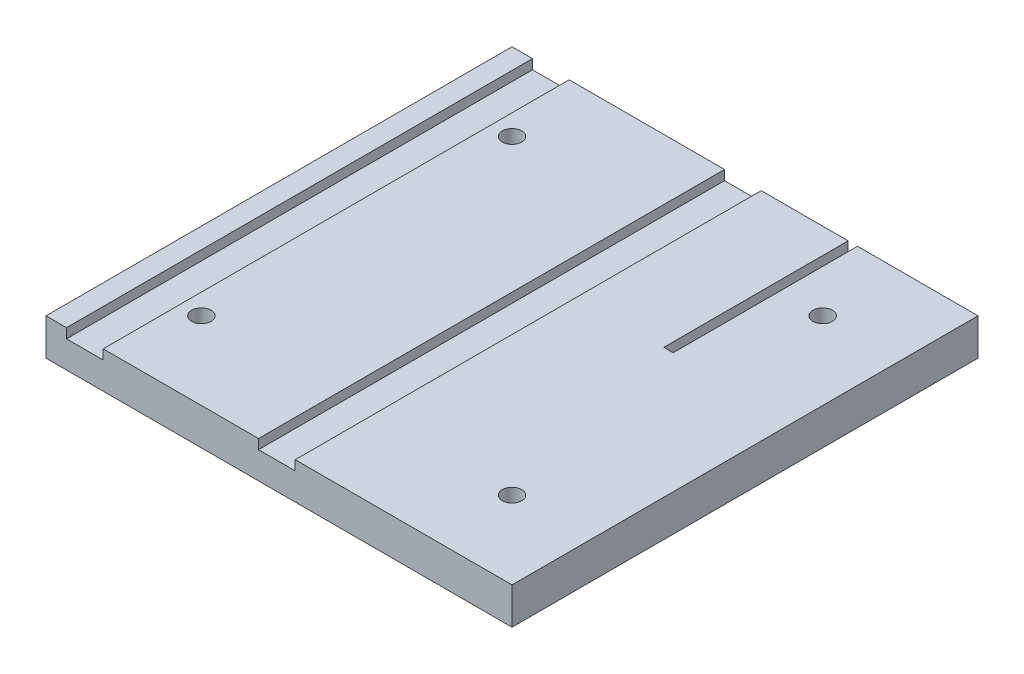
ISO-10303-21;
HEADER;
FILE_DESCRIPTION(('STEP AP214'),'2;1');
FILE_NAME('part.step','',(''),(''),'','','');
FILE_SCHEMA(('AUTOMOTIVE_DESIGN { 1 0 10303 214 1 1 1 1 }'));
ENDSEC;
DATA;
#1=APPLICATION_CONTEXT('core data for automotive mechanical design processes');
#2=APPLICATION_PROTOCOL_DEFINITION('international standard','automotive_design',2000,#1);
#3=PRODUCT_CONTEXT('',#1,'mechanical');
#4=PRODUCT('Part','Part','',(#3));
#5=PRODUCT_RELATED_PRODUCT_CATEGORY('part','',(#4));
#6=PRODUCT_DEFINITION_FORMATION('','',#4);
#7=PRODUCT_DEFINITION_CONTEXT('part definition',#1,'design');
#8=PRODUCT_DEFINITION('design','',#6,#7);
#9=PRODUCT_DEFINITION_SHAPE('','',#8);
#10=(LENGTH_UNIT() NAMED_UNIT(*) SI_UNIT(.MILLI.,.METRE.));
#11=(NAMED_UNIT(*) PLANE_ANGLE_UNIT() SI_UNIT($,.RADIAN.));
#12=(NAMED_UNIT(*) SI_UNIT($,.STERADIAN.) SOLID_ANGLE_UNIT());
#13=UNCERTAINTY_MEASURE_WITH_UNIT(LENGTH_MEASURE(1.E-05),#10,'distance_accuracy_value','');
#14=(GEOMETRIC_REPRESENTATION_CONTEXT(3) GLOBAL_UNCERTAINTY_ASSIGNED_CONTEXT((#13)) GLOBAL_UNIT_ASSIGNED_CONTEXT((#10,
#11,#12)) REPRESENTATION_CONTEXT('',''));
#15=CARTESIAN_POINT('',(0.,0.,0.));
#16=DIRECTION('',(0.,0.,1.));
#17=DIRECTION('',(1.,0.,0.));
#18=AXIS2_PLACEMENT_3D('',#15,#16,#17);
#19=CARTESIAN_POINT('',(0.,12.,0.));
#20=DIRECTION('',(0.,1.,0.));
#21=DIRECTION('',(0.,0.,1.));
#22=AXIS2_PLACEMENT_3D('',#19,#20,#21);
#23=PLANE('',#22);
#24=DIRECTION('',(0.,0.,1.));
#25=VECTOR('',#24,1.);
#26=CARTESIAN_POINT('',(-6.70001200000002,12.,76.2));
#27=LINE('',#26,#25);
#28=CARTESIAN_POINT('',(-6.70001200000002,12.,-76.2));
#29=VERTEX_POINT('',#28);
#30=CARTESIAN_POINT('',(-6.70001200000002,12.,76.2));
#31=VERTEX_POINT('',#30);
#32=EDGE_CURVE('E189',#29,#31,#27,.T.);
#33=ORIENTED_EDGE('',*,*,#32,.F.);
#34=DIRECTION('',(-1.,0.,0.));
#35=VECTOR('',#34,1.);
#36=CARTESIAN_POINT('',(-76.2,12.,-76.2));
#37=LINE('',#36,#35);
#38=CARTESIAN_POINT('',(-57.4999993,12.,-76.2));
#39=VERTEX_POINT('',#38);
#40=EDGE_CURVE('E253',#29,#39,#37,.T.);
#41=ORIENTED_EDGE('',*,*,#40,.T.);
#42=DIRECTION('',(0.,0.,-1.));
#43=VECTOR('',#42,1.);
#44=CARTESIAN_POINT('',(-57.4999993,12.,76.2));
#45=LINE('',#44,#43);
#46=CARTESIAN_POINT('',(-57.4999993,12.,76.2));
#47=VERTEX_POINT('',#46);
#48=EDGE_CURVE('E195',#47,#39,#45,.T.);
#49=ORIENTED_EDGE('',*,*,#48,.F.);
#50=DIRECTION('',(1.,0.,0.));
#51=VECTOR('',#50,1.);
#52=CARTESIAN_POINT('',(-76.2,12.,76.2));
#53=LINE('',#52,#51);
#54=EDGE_CURVE('E259',#47,#31,#53,.T.);
#55=ORIENTED_EDGE('',*,*,#54,.T.);
#56=EDGE_LOOP('',(#33,#41,#49,#55));
#57=FACE_BOUND('',#56,.T.);
#58=CARTESIAN_POINT('',(-50.8,12.,-50.8));
#59=DIRECTION('',(0.,1.,0.));
#60=DIRECTION('',(0.,0.,1.));
#61=AXIS2_PLACEMENT_3D('',#58,#59,#60);
#62=CIRCLE('',#61,3.175);
#63=CARTESIAN_POINT('',(-50.8,12.,-47.625));
#64=VERTEX_POINT('',#63);
#65=EDGE_CURVE('E237',#64,#64,#62,.T.);
#66=ORIENTED_EDGE('',*,*,#65,.F.);
#67=EDGE_LOOP('',(#66));
#68=FACE_BOUND('',#67,.T.);
#69=CARTESIAN_POINT('',(-50.8,12.,50.8));
#70=DIRECTION('',(0.,1.,0.));
#71=DIRECTION('',(0.,0.,1.));
#72=AXIS2_PLACEMENT_3D('',#69,#70,#71);
#73=CIRCLE('',#72,3.175);
#74=CARTESIAN_POINT('',(-50.8,12.,53.975));
#75=VERTEX_POINT('',#74);
#76=EDGE_CURVE('E225',#75,#75,#73,.T.);
#77=ORIENTED_EDGE('',*,*,#76,.F.);
#78=EDGE_LOOP('',(#77));
#79=FACE_BOUND('',#78,.T.);
#80=ADVANCED_FACE('F33',(#57,#68,#79),#23,.T.);
#81=DIRECTION('',(0.,0.,1.));
#82=VECTOR('',#81,1.);
#83=CARTESIAN_POINT('',(-69.5000007,12.,76.2));
#84=LINE('',#83,#82);
#85=CARTESIAN_POINT('',(-69.5000007,12.,-76.2));
#86=VERTEX_POINT('',#85);
#87=CARTESIAN_POINT('',(-69.5000007,12.,76.2));
#88=VERTEX_POINT('',#87);
#89=EDGE_CURVE('E205',#86,#88,#84,.T.);
#90=ORIENTED_EDGE('',*,*,#89,.F.);
#91=CARTESIAN_POINT('',(-76.2,12.,-76.2));
#92=VERTEX_POINT('',#91);
#93=EDGE_CURVE('E246',#86,#92,#37,.T.);
#94=ORIENTED_EDGE('',*,*,#93,.T.);
#95=DIRECTION('',(0.,0.,1.));
#96=VECTOR('',#95,1.);
#97=CARTESIAN_POINT('',(-76.2,12.,-76.2));
#98=LINE('',#97,#96);
#99=CARTESIAN_POINT('',(-76.2,12.,76.2));
#100=VERTEX_POINT('',#99);
#101=EDGE_CURVE('E251',#92,#100,#98,.T.);
#102=ORIENTED_EDGE('',*,*,#101,.T.);
#103=EDGE_CURVE('E255',#100,#88,#53,.T.);
#104=ORIENTED_EDGE('',*,*,#103,.T.);
#105=EDGE_LOOP('',(#90,#94,#102,#104));
#106=FACE_BOUND('',#105,.T.);
#107=ADVANCED_FACE('F311',(#106),#23,.T.);
#108=DIRECTION('',(0.,0.,-1.));
#109=VECTOR('',#108,1.);
#110=CARTESIAN_POINT('',(5.29998939999998,12.,76.2));
#111=LINE('',#110,#109);
#112=CARTESIAN_POINT('',(5.29998939999998,12.,76.2));
#113=VERTEX_POINT('',#112);
#114=CARTESIAN_POINT('',(5.29998939999998,12.,-76.2));
#115=VERTEX_POINT('',#114);
#116=EDGE_CURVE('E521',#113,#115,#111,.T.);
#117=ORIENTED_EDGE('',*,*,#116,.F.);
#118=CARTESIAN_POINT('',(76.2,12.,76.2));
#119=VERTEX_POINT('',#118);
#120=EDGE_CURVE('E166',#113,#119,#53,.T.);
#121=ORIENTED_EDGE('',*,*,#120,.T.);
#122=DIRECTION('',(0.,0.,-1.));
#123=VECTOR('',#122,1.);
#124=CARTESIAN_POINT('',(76.2,12.,-76.2));
#125=LINE('',#124,#123);
#126=CARTESIAN_POINT('',(76.2,12.,-76.2));
#127=VERTEX_POINT('',#126);
#128=EDGE_CURVE('E243',#119,#127,#125,.T.);
#129=ORIENTED_EDGE('',*,*,#128,.T.);
#130=CARTESIAN_POINT('',(36.8088357500037,12.,-76.2));
#131=VERTEX_POINT('',#130);
#132=EDGE_CURVE('E248',#127,#131,#37,.T.);
#133=ORIENTED_EDGE('',*,*,#132,.T.);
#134=DIRECTION('',(0.,0.,-1.));
#135=VECTOR('',#134,1.);
#136=CARTESIAN_POINT('',(36.8088357500037,12.,-119.974543138576));
#137=LINE('',#136,#135);
#138=CARTESIAN_POINT('',(36.8088357500037,12.,-15.8924573636444));
#139=VERTEX_POINT('',#138);
#140=EDGE_CURVE('E181',#139,#131,#137,.T.);
#141=ORIENTED_EDGE('',*,*,#140,.F.);
#142=DIRECTION('',(1.,0.,0.));
#143=VECTOR('',#142,1.);
#144=CARTESIAN_POINT('',(33.7325179438481,12.,-15.8924573636444));
#145=LINE('',#144,#143);
#146=CARTESIAN_POINT('',(33.7325179438481,12.,-15.8924573636444));
#147=VERTEX_POINT('',#146);
#148=EDGE_CURVE('E176',#147,#139,#145,.T.);
#149=ORIENTED_EDGE('',*,*,#148,.F.);
#150=DIRECTION('',(0.,0.,1.));
#151=VECTOR('',#150,1.);
#152=CARTESIAN_POINT('',(33.7325179438481,12.,-119.974543138576));
#153=LINE('',#152,#151);
#154=CARTESIAN_POINT('',(33.7325179438481,12.,-76.2));
#155=VERTEX_POINT('',#154);
#156=EDGE_CURVE('E183',#155,#147,#153,.T.);
#157=ORIENTED_EDGE('',*,*,#156,.F.);
#158=EDGE_CURVE('E252',#155,#115,#37,.T.);
#159=ORIENTED_EDGE('',*,*,#158,.T.);
#160=EDGE_LOOP('',(#117,#121,#129,#133,#141,#149,#157,#159));
#161=FACE_BOUND('',#160,.T.);
#162=CARTESIAN_POINT('',(50.8,12.,-50.8));
#163=DIRECTION('',(0.,1.,0.));
#164=DIRECTION('',(0.,0.,1.));
#165=AXIS2_PLACEMENT_3D('',#162,#163,#164);
#166=CIRCLE('',#165,3.175);
#167=CARTESIAN_POINT('',(50.8,12.,-47.625));
#168=VERTEX_POINT('',#167);
#169=EDGE_CURVE('E231',#168,#168,#166,.T.);
#170=ORIENTED_EDGE('',*,*,#169,.F.);
#171=EDGE_LOOP('',(#170));
#172=FACE_BOUND('',#171,.T.);
#173=CARTESIAN_POINT('',(50.8,12.,50.8));
#174=DIRECTION('',(0.,1.,0.));
#175=DIRECTION('',(0.,0.,1.));
#176=AXIS2_PLACEMENT_3D('',#173,#174,#175);
#177=CIRCLE('',#176,3.175);
#178=CARTESIAN_POINT('',(50.8,12.,53.975));
#179=VERTEX_POINT('',#178);
#180=EDGE_CURVE('E219',#179,#179,#177,.T.);
#181=ORIENTED_EDGE('',*,*,#180,.F.);
#182=EDGE_LOOP('',(#181));
#183=FACE_BOUND('',#182,.T.);
#184=ADVANCED_FACE('F293',(#161,#172,#183),#23,.T.);
#185=CARTESIAN_POINT('',(0.,0.,0.));
#186=DIRECTION('',(0.,1.,0.));
#187=DIRECTION('',(0.,0.,1.));
#188=AXIS2_PLACEMENT_3D('',#185,#186,#187);
#189=PLANE('',#188);
#190=DIRECTION('',(0.,0.,-1.));
#191=VECTOR('',#190,1.);
#192=CARTESIAN_POINT('',(76.2,0.,-76.2));
#193=LINE('',#192,#191);
#194=CARTESIAN_POINT('',(76.2,0.,76.2));
#195=VERTEX_POINT('',#194);
#196=CARTESIAN_POINT('',(76.2,0.,-76.2));
#197=VERTEX_POINT('',#196);
#198=EDGE_CURVE('E240',#195,#197,#193,.T.);
#199=ORIENTED_EDGE('',*,*,#198,.F.);
#200=DIRECTION('',(1.,0.,0.));
#201=VECTOR('',#200,1.);
#202=CARTESIAN_POINT('',(-76.2,0.,76.2));
#203=LINE('',#202,#201);
#204=CARTESIAN_POINT('',(-76.2,0.,76.2));
#205=VERTEX_POINT('',#204);
#206=EDGE_CURVE('E247',#205,#195,#203,.T.);
#207=ORIENTED_EDGE('',*,*,#206,.F.);
#208=DIRECTION('',(0.,0.,1.));
#209=VECTOR('',#208,1.);
#210=CARTESIAN_POINT('',(-76.2,0.,-76.2));
#211=LINE('',#210,#209);
#212=CARTESIAN_POINT('',(-76.2,0.,-76.2));
#213=VERTEX_POINT('',#212);
#214=EDGE_CURVE('E264',#213,#205,#211,.T.);
#215=ORIENTED_EDGE('',*,*,#214,.F.);
#216=DIRECTION('',(-1.,0.,0.));
#217=VECTOR('',#216,1.);
#218=CARTESIAN_POINT('',(-76.2,0.,-76.2));
#219=LINE('',#218,#217);
#220=EDGE_CURVE('E262',#197,#213,#219,.T.);
#221=ORIENTED_EDGE('',*,*,#220,.F.);
#222=EDGE_LOOP('',(#199,#207,#215,#221));
#223=FACE_BOUND('',#222,.T.);
#224=CARTESIAN_POINT('',(-50.8,0.,-50.8));
#225=DIRECTION('',(0.,1.,0.));
#226=DIRECTION('',(0.,0.,1.));
#227=AXIS2_PLACEMENT_3D('',#224,#225,#226);
#228=CIRCLE('',#227,3.175);
#229=CARTESIAN_POINT('',(-50.8,0.,-47.625));
#230=VERTEX_POINT('',#229);
#231=EDGE_CURVE('E234',#230,#230,#228,.T.);
#232=ORIENTED_EDGE('',*,*,#231,.T.);
#233=EDGE_LOOP('',(#232));
#234=FACE_BOUND('',#233,.T.);
#235=CARTESIAN_POINT('',(50.8,0.,-50.8));
#236=DIRECTION('',(0.,1.,0.));
#237=DIRECTION('',(0.,0.,1.));
#238=AXIS2_PLACEMENT_3D('',#235,#236,#237);
#239=CIRCLE('',#238,3.175);
#240=CARTESIAN_POINT('',(50.8,0.,-47.625));
#241=VERTEX_POINT('',#240);
#242=EDGE_CURVE('E228',#241,#241,#239,.T.);
#243=ORIENTED_EDGE('',*,*,#242,.T.);
#244=EDGE_LOOP('',(#243));
#245=FACE_BOUND('',#244,.T.);
#246=CARTESIAN_POINT('',(-50.8,0.,50.8));
#247=DIRECTION('',(0.,1.,0.));
#248=DIRECTION('',(0.,0.,1.));
#249=AXIS2_PLACEMENT_3D('',#246,#247,#248);
#250=CIRCLE('',#249,3.175);
#251=CARTESIAN_POINT('',(-50.8,0.,53.975));
#252=VERTEX_POINT('',#251);
#253=EDGE_CURVE('E222',#252,#252,#250,.T.);
#254=ORIENTED_EDGE('',*,*,#253,.T.);
#255=EDGE_LOOP('',(#254));
#256=FACE_BOUND('',#255,.T.);
#257=CARTESIAN_POINT('',(50.8,0.,50.8));
#258=DIRECTION('',(0.,1.,0.));
#259=DIRECTION('',(0.,0.,1.));
#260=AXIS2_PLACEMENT_3D('',#257,#258,#259);
#261=CIRCLE('',#260,3.175);
#262=CARTESIAN_POINT('',(50.8,0.,53.975));
#263=VERTEX_POINT('',#262);
#264=EDGE_CURVE('E211',#263,#263,#261,.T.);
#265=ORIENTED_EDGE('',*,*,#264,.T.);
#266=EDGE_LOOP('',(#265));
#267=FACE_BOUND('',#266,.T.);
#268=ADVANCED_FACE('F323',(#223,#234,#245,#256,#267),#189,.F.);
#269=CARTESIAN_POINT('',(76.2,12.,-76.2));
#270=DIRECTION('',(-1.,0.,0.));
#271=DIRECTION('',(0.,0.,1.));
#272=AXIS2_PLACEMENT_3D('',#269,#270,#271);
#273=PLANE('',#272);
#274=ORIENTED_EDGE('',*,*,#198,.T.);
#275=DIRECTION('',(0.,-1.,0.));
#276=VECTOR('',#275,1.);
#277=CARTESIAN_POINT('',(76.2,12.,-76.2));
#278=LINE('',#277,#276);
#279=EDGE_CURVE('E275',#127,#197,#278,.T.);
#280=ORIENTED_EDGE('',*,*,#279,.F.);
#281=ORIENTED_EDGE('',*,*,#128,.F.);
#282=DIRECTION('',(0.,-1.,0.));
#283=VECTOR('',#282,1.);
#284=CARTESIAN_POINT('',(76.2,12.,76.2));
#285=LINE('',#284,#283);
#286=EDGE_CURVE('E258',#119,#195,#285,.T.);
#287=ORIENTED_EDGE('',*,*,#286,.T.);
#288=EDGE_LOOP('',(#274,#280,#281,#287));
#289=FACE_BOUND('',#288,.T.);
#290=ADVANCED_FACE('F35',(#289),#273,.F.);
#291=CARTESIAN_POINT('',(-76.2,12.,-76.2));
#292=DIRECTION('',(0.,0.,1.));
#293=DIRECTION('',(1.,0.,0.));
#294=AXIS2_PLACEMENT_3D('',#291,#292,#293);
#295=PLANE('',#294);
#296=ORIENTED_EDGE('',*,*,#40,.F.);
#297=DIRECTION('',(0.,1.,0.));
#298=VECTOR('',#297,1.);
#299=CARTESIAN_POINT('',(-6.70001200000002,8.825,-76.2));
#300=LINE('',#299,#298);
#301=CARTESIAN_POINT('',(-6.70001200000002,8.825,-76.2));
#302=VERTEX_POINT('',#301);
#303=EDGE_CURVE('E169',#302,#29,#300,.T.);
#304=ORIENTED_EDGE('',*,*,#303,.F.);
#305=DIRECTION('',(-1.,0.,0.));
#306=VECTOR('',#305,1.);
#307=CARTESIAN_POINT('',(5.29998939999998,8.825,-76.2));
#308=LINE('',#307,#306);
#309=CARTESIAN_POINT('',(5.29998939999998,8.825,-76.2));
#310=VERTEX_POINT('',#309);
#311=EDGE_CURVE('E155',#310,#302,#308,.T.);
#312=ORIENTED_EDGE('',*,*,#311,.F.);
#313=DIRECTION('',(0.,1.,0.));
#314=VECTOR('',#313,1.);
#315=CARTESIAN_POINT('',(5.29998939999998,8.825,-76.2));
#316=LINE('',#315,#314);
#317=EDGE_CURVE('E153',#310,#115,#316,.T.);
#318=ORIENTED_EDGE('',*,*,#317,.T.);
#319=ORIENTED_EDGE('',*,*,#158,.F.);
#320=DIRECTION('',(0.,-1.,0.));
#321=VECTOR('',#320,1.);
#322=CARTESIAN_POINT('',(33.7325179438481,12.,-76.2));
#323=LINE('',#322,#321);
#324=CARTESIAN_POINT('',(33.7325179438481,8.825,-76.2));
#325=VERTEX_POINT('',#324);
#326=EDGE_CURVE('E41',#155,#325,#323,.T.);
#327=ORIENTED_EDGE('',*,*,#326,.T.);
#328=DIRECTION('',(-1.,0.,0.));
#329=VECTOR('',#328,1.);
#330=CARTESIAN_POINT('',(-76.2,8.825,-76.2));
#331=LINE('',#330,#329);
#332=CARTESIAN_POINT('',(36.8088357500037,8.825,-76.2));
#333=VERTEX_POINT('',#332);
#334=EDGE_CURVE('E278',#333,#325,#331,.T.);
#335=ORIENTED_EDGE('',*,*,#334,.F.);
#336=DIRECTION('',(0.,1.,0.));
#337=VECTOR('',#336,1.);
#338=CARTESIAN_POINT('',(36.8088357500037,12.,-76.2));
#339=LINE('',#338,#337);
#340=EDGE_CURVE('E11',#333,#131,#339,.T.);
#341=ORIENTED_EDGE('',*,*,#340,.T.);
#342=ORIENTED_EDGE('',*,*,#132,.F.);
#343=ORIENTED_EDGE('',*,*,#279,.T.);
#344=ORIENTED_EDGE('',*,*,#220,.T.);
#345=DIRECTION('',(0.,-1.,0.));
#346=VECTOR('',#345,1.);
#347=CARTESIAN_POINT('',(-76.2,12.,-76.2));
#348=LINE('',#347,#346);
#349=EDGE_CURVE('E272',#92,#213,#348,.T.);
#350=ORIENTED_EDGE('',*,*,#349,.F.);
#351=ORIENTED_EDGE('',*,*,#93,.F.);
#352=DIRECTION('',(0.,1.,0.));
#353=VECTOR('',#352,1.);
#354=CARTESIAN_POINT('',(-69.5000007,8.825,-76.2));
#355=LINE('',#354,#353);
#356=CARTESIAN_POINT('',(-69.5000007,8.825,-76.2));
#357=VERTEX_POINT('',#356);
#358=EDGE_CURVE('E209',#357,#86,#355,.T.);
#359=ORIENTED_EDGE('',*,*,#358,.F.);
#360=DIRECTION('',(-1.,0.,0.));
#361=VECTOR('',#360,1.);
#362=CARTESIAN_POINT('',(-57.4999993,8.825,-76.2));
#363=LINE('',#362,#361);
#364=CARTESIAN_POINT('',(-57.4999993,8.825,-76.2));
#365=VERTEX_POINT('',#364);
#366=EDGE_CURVE('E201',#365,#357,#363,.T.);
#367=ORIENTED_EDGE('',*,*,#366,.F.);
#368=DIRECTION('',(0.,1.,0.));
#369=VECTOR('',#368,1.);
#370=CARTESIAN_POINT('',(-57.4999993,8.825,-76.2));
#371=LINE('',#370,#369);
#372=EDGE_CURVE('E212',#365,#39,#371,.T.);
#373=ORIENTED_EDGE('',*,*,#372,.T.);
#374=EDGE_LOOP('',(#296,#304,#312,#318,#319,#327,#335,#341,#342,#343,#344,#350,#351,#359,#367,#373));
#375=FACE_BOUND('',#374,.T.);
#376=ADVANCED_FACE('F284',(#375),#295,.F.);
#377=CARTESIAN_POINT('',(-76.2,12.,-76.2));
#378=DIRECTION('',(1.,0.,0.));
#379=DIRECTION('',(0.,0.,-1.));
#380=AXIS2_PLACEMENT_3D('',#377,#378,#379);
#381=PLANE('',#380);
#382=ORIENTED_EDGE('',*,*,#214,.T.);
#383=DIRECTION('',(0.,-1.,0.));
#384=VECTOR('',#383,1.);
#385=CARTESIAN_POINT('',(-76.2,12.,76.2));
#386=LINE('',#385,#384);
#387=EDGE_CURVE('E269',#100,#205,#386,.T.);
#388=ORIENTED_EDGE('',*,*,#387,.F.);
#389=ORIENTED_EDGE('',*,*,#101,.F.);
#390=ORIENTED_EDGE('',*,*,#349,.T.);
#391=EDGE_LOOP('',(#382,#388,#389,#390));
#392=FACE_BOUND('',#391,.T.);
#393=ADVANCED_FACE('F338',(#392),#381,.F.);
#394=CARTESIAN_POINT('',(-76.2,12.,76.2));
#395=DIRECTION('',(0.,0.,-1.));
#396=DIRECTION('',(-1.,0.,0.));
#397=AXIS2_PLACEMENT_3D('',#394,#395,#396);
#398=PLANE('',#397);
#399=DIRECTION('',(1.,0.,0.));
#400=VECTOR('',#399,1.);
#401=CARTESIAN_POINT('',(5.29998939999998,8.825,76.2));
#402=LINE('',#401,#400);
#403=CARTESIAN_POINT('',(-6.70001200000002,8.825,76.2));
#404=VERTEX_POINT('',#403);
#405=CARTESIAN_POINT('',(5.29998939999998,8.825,76.2));
#406=VERTEX_POINT('',#405);
#407=EDGE_CURVE('E156',#404,#406,#402,.T.);
#408=ORIENTED_EDGE('',*,*,#407,.F.);
#409=DIRECTION('',(0.,1.,0.));
#410=VECTOR('',#409,1.);
#411=CARTESIAN_POINT('',(-6.70001200000002,8.825,76.2));
#412=LINE('',#411,#410);
#413=EDGE_CURVE('E167',#404,#31,#412,.T.);
#414=ORIENTED_EDGE('',*,*,#413,.T.);
#415=ORIENTED_EDGE('',*,*,#54,.F.);
#416=DIRECTION('',(0.,1.,0.));
#417=VECTOR('',#416,1.);
#418=CARTESIAN_POINT('',(-57.4999993,8.825,76.2));
#419=LINE('',#418,#417);
#420=CARTESIAN_POINT('',(-57.4999993,8.825,76.2));
#421=VERTEX_POINT('',#420);
#422=EDGE_CURVE('E215',#421,#47,#419,.T.);
#423=ORIENTED_EDGE('',*,*,#422,.F.);
#424=DIRECTION('',(1.,0.,0.));
#425=VECTOR('',#424,1.);
#426=CARTESIAN_POINT('',(-57.4999993,8.825,76.2));
#427=LINE('',#426,#425);
#428=CARTESIAN_POINT('',(-69.5000007,8.825,76.2));
#429=VERTEX_POINT('',#428);
#430=EDGE_CURVE('E194',#429,#421,#427,.T.);
#431=ORIENTED_EDGE('',*,*,#430,.F.);
#432=DIRECTION('',(0.,1.,0.));
#433=VECTOR('',#432,1.);
#434=CARTESIAN_POINT('',(-69.5000007,8.825,76.2));
#435=LINE('',#434,#433);
#436=EDGE_CURVE('E204',#429,#88,#435,.T.);
#437=ORIENTED_EDGE('',*,*,#436,.T.);
#438=ORIENTED_EDGE('',*,*,#103,.F.);
#439=ORIENTED_EDGE('',*,*,#387,.T.);
#440=ORIENTED_EDGE('',*,*,#206,.T.);
#441=ORIENTED_EDGE('',*,*,#286,.F.);
#442=ORIENTED_EDGE('',*,*,#120,.F.);
#443=DIRECTION('',(0.,1.,0.));
#444=VECTOR('',#443,1.);
#445=CARTESIAN_POINT('',(5.29998939999998,8.825,76.2));
#446=LINE('',#445,#444);
#447=EDGE_CURVE('E150',#406,#113,#446,.T.);
#448=ORIENTED_EDGE('',*,*,#447,.F.);
#449=EDGE_LOOP('',(#408,#414,#415,#423,#431,#437,#438,#439,#440,#441,#442,#448));
#450=FACE_BOUND('',#449,.T.);
#451=ADVANCED_FACE('F164',(#450),#398,.F.);
#452=CARTESIAN_POINT('',(-50.8,12.,-50.8));
#453=DIRECTION('',(0.,-1.,0.));
#454=DIRECTION('',(0.,0.,-1.));
#455=AXIS2_PLACEMENT_3D('',#452,#453,#454);
#456=CYLINDRICAL_SURFACE('',#455,3.175);
#457=ORIENTED_EDGE('',*,*,#65,.T.);
#458=EDGE_LOOP('',(#457));
#459=FACE_BOUND('',#458,.T.);
#460=ORIENTED_EDGE('',*,*,#231,.F.);
#461=EDGE_LOOP('',(#460));
#462=FACE_BOUND('',#461,.T.);
#463=ADVANCED_FACE('F337',(#459,#462),#456,.F.);
#464=CARTESIAN_POINT('',(50.8,12.,-50.8));
#465=DIRECTION('',(0.,-1.,0.));
#466=DIRECTION('',(0.,0.,-1.));
#467=AXIS2_PLACEMENT_3D('',#464,#465,#466);
#468=CYLINDRICAL_SURFACE('',#467,3.175);
#469=ORIENTED_EDGE('',*,*,#169,.T.);
#470=EDGE_LOOP('',(#469));
#471=FACE_BOUND('',#470,.T.);
#472=ORIENTED_EDGE('',*,*,#242,.F.);
#473=EDGE_LOOP('',(#472));
#474=FACE_BOUND('',#473,.T.);
#475=ADVANCED_FACE('F361',(#471,#474),#468,.F.);
#476=CARTESIAN_POINT('',(-50.8,12.,50.8));
#477=DIRECTION('',(0.,-1.,0.));
#478=DIRECTION('',(0.,0.,-1.));
#479=AXIS2_PLACEMENT_3D('',#476,#477,#478);
#480=CYLINDRICAL_SURFACE('',#479,3.175);
#481=ORIENTED_EDGE('',*,*,#76,.T.);
#482=EDGE_LOOP('',(#481));
#483=FACE_BOUND('',#482,.T.);
#484=ORIENTED_EDGE('',*,*,#253,.F.);
#485=EDGE_LOOP('',(#484));
#486=FACE_BOUND('',#485,.T.);
#487=ADVANCED_FACE('F368',(#483,#486),#480,.F.);
#488=CARTESIAN_POINT('',(50.8,12.,50.8));
#489=DIRECTION('',(0.,-1.,0.));
#490=DIRECTION('',(0.,0.,-1.));
#491=AXIS2_PLACEMENT_3D('',#488,#489,#490);
#492=CYLINDRICAL_SURFACE('',#491,3.175);
#493=ORIENTED_EDGE('',*,*,#180,.T.);
#494=EDGE_LOOP('',(#493));
#495=FACE_BOUND('',#494,.T.);
#496=ORIENTED_EDGE('',*,*,#264,.F.);
#497=EDGE_LOOP('',(#496));
#498=FACE_BOUND('',#497,.T.);
#499=ADVANCED_FACE('F376',(#495,#498),#492,.F.);
#500=CARTESIAN_POINT('',(-69.5000007,8.825,76.2));
#501=DIRECTION('',(-1.,0.,0.));
#502=DIRECTION('',(0.,0.,1.));
#503=AXIS2_PLACEMENT_3D('',#500,#501,#502);
#504=PLANE('',#503);
#505=ORIENTED_EDGE('',*,*,#89,.T.);
#506=ORIENTED_EDGE('',*,*,#436,.F.);
#507=DIRECTION('',(0.,0.,1.));
#508=VECTOR('',#507,1.);
#509=CARTESIAN_POINT('',(-69.5000007,8.825,76.2));
#510=LINE('',#509,#508);
#511=EDGE_CURVE('E192',#357,#429,#510,.T.);
#512=ORIENTED_EDGE('',*,*,#511,.F.);
#513=ORIENTED_EDGE('',*,*,#358,.T.);
#514=EDGE_LOOP('',(#505,#506,#512,#513));
#515=FACE_BOUND('',#514,.T.);
#516=ADVANCED_FACE('F384',(#515),#504,.F.);
#517=CARTESIAN_POINT('',(-57.4999993,8.825,76.2));
#518=DIRECTION('',(1.,0.,0.));
#519=DIRECTION('',(0.,0.,-1.));
#520=AXIS2_PLACEMENT_3D('',#517,#518,#519);
#521=PLANE('',#520);
#522=ORIENTED_EDGE('',*,*,#48,.T.);
#523=ORIENTED_EDGE('',*,*,#372,.F.);
#524=DIRECTION('',(0.,0.,-1.));
#525=VECTOR('',#524,1.);
#526=CARTESIAN_POINT('',(-57.4999993,8.825,76.2));
#527=LINE('',#526,#525);
#528=EDGE_CURVE('E198',#421,#365,#527,.T.);
#529=ORIENTED_EDGE('',*,*,#528,.F.);
#530=ORIENTED_EDGE('',*,*,#422,.T.);
#531=EDGE_LOOP('',(#522,#523,#529,#530));
#532=FACE_BOUND('',#531,.T.);
#533=ADVANCED_FACE('F391',(#532),#521,.F.);
#534=CARTESIAN_POINT('',(0.,8.825,0.));
#535=DIRECTION('',(0.,1.,0.));
#536=DIRECTION('',(0.,0.,1.));
#537=AXIS2_PLACEMENT_3D('',#534,#535,#536);
#538=PLANE('',#537);
#539=ORIENTED_EDGE('',*,*,#511,.T.);
#540=ORIENTED_EDGE('',*,*,#430,.T.);
#541=ORIENTED_EDGE('',*,*,#528,.T.);
#542=ORIENTED_EDGE('',*,*,#366,.T.);
#543=EDGE_LOOP('',(#539,#540,#541,#542));
#544=FACE_BOUND('',#543,.T.);
#545=ADVANCED_FACE('F399',(#544),#538,.T.);
#546=CARTESIAN_POINT('',(-6.70001200000002,8.825,76.2));
#547=DIRECTION('',(-1.,0.,0.));
#548=DIRECTION('',(0.,0.,1.));
#549=AXIS2_PLACEMENT_3D('',#546,#547,#548);
#550=PLANE('',#549);
#551=ORIENTED_EDGE('',*,*,#32,.T.);
#552=ORIENTED_EDGE('',*,*,#413,.F.);
#553=DIRECTION('',(0.,0.,1.));
#554=VECTOR('',#553,1.);
#555=CARTESIAN_POINT('',(-6.70001200000002,8.825,76.2));
#556=LINE('',#555,#554);
#557=EDGE_CURVE('E56',#302,#404,#556,.T.);
#558=ORIENTED_EDGE('',*,*,#557,.F.);
#559=ORIENTED_EDGE('',*,*,#303,.T.);
#560=EDGE_LOOP('',(#551,#552,#558,#559));
#561=FACE_BOUND('',#560,.T.);
#562=ADVANCED_FACE('F407',(#561),#550,.F.);
#563=CARTESIAN_POINT('',(5.29998939999998,8.825,76.2));
#564=DIRECTION('',(1.,0.,0.));
#565=DIRECTION('',(0.,0.,-1.));
#566=AXIS2_PLACEMENT_3D('',#563,#564,#565);
#567=PLANE('',#566);
#568=ORIENTED_EDGE('',*,*,#116,.T.);
#569=ORIENTED_EDGE('',*,*,#317,.F.);
#570=DIRECTION('',(0.,0.,-1.));
#571=VECTOR('',#570,1.);
#572=CARTESIAN_POINT('',(5.29998939999998,8.825,76.2));
#573=LINE('',#572,#571);
#574=EDGE_CURVE('E147',#406,#310,#573,.T.);
#575=ORIENTED_EDGE('',*,*,#574,.F.);
#576=ORIENTED_EDGE('',*,*,#447,.T.);
#577=EDGE_LOOP('',(#568,#569,#575,#576));
#578=FACE_BOUND('',#577,.T.);
#579=ADVANCED_FACE('F148',(#578),#567,.F.);
#580=CARTESIAN_POINT('',(0.,8.825,0.));
#581=DIRECTION('',(0.,1.,0.));
#582=DIRECTION('',(0.,0.,1.));
#583=AXIS2_PLACEMENT_3D('',#580,#581,#582);
#584=PLANE('',#583);
#585=ORIENTED_EDGE('',*,*,#557,.T.);
#586=ORIENTED_EDGE('',*,*,#407,.T.);
#587=ORIENTED_EDGE('',*,*,#574,.T.);
#588=ORIENTED_EDGE('',*,*,#311,.T.);
#589=EDGE_LOOP('',(#585,#586,#587,#588));
#590=FACE_BOUND('',#589,.T.);
#591=ADVANCED_FACE('F159',(#590),#584,.T.);
#592=CARTESIAN_POINT('',(36.8088357500037,8.825,-119.974543138576));
#593=DIRECTION('',(1.,0.,0.));
#594=DIRECTION('',(0.,0.,-1.));
#595=AXIS2_PLACEMENT_3D('',#592,#593,#594);
#596=PLANE('',#595);
#597=DIRECTION('',(0.,0.,-1.));
#598=VECTOR('',#597,1.);
#599=CARTESIAN_POINT('',(36.8088357500037,8.825,-119.974543138576));
#600=LINE('',#599,#598);
#601=CARTESIAN_POINT('',(36.8088357500037,8.825,-15.8924573636444));
#602=VERTEX_POINT('',#601);
#603=EDGE_CURVE('E48',#602,#333,#600,.T.);
#604=ORIENTED_EDGE('',*,*,#603,.F.);
#605=DIRECTION('',(0.,1.,0.));
#606=VECTOR('',#605,1.);
#607=CARTESIAN_POINT('',(36.8088357500037,8.825,-15.8924573636444));
#608=LINE('',#607,#606);
#609=EDGE_CURVE('E187',#602,#139,#608,.T.);
#610=ORIENTED_EDGE('',*,*,#609,.T.);
#611=ORIENTED_EDGE('',*,*,#140,.T.);
#612=ORIENTED_EDGE('',*,*,#340,.F.);
#613=EDGE_LOOP('',(#604,#610,#611,#612));
#614=FACE_BOUND('',#613,.T.);
#615=ADVANCED_FACE('F307',(#614),#596,.F.);
#616=CARTESIAN_POINT('',(33.7325179438481,8.825,-119.974543138576));
#617=DIRECTION('',(-1.,0.,0.));
#618=DIRECTION('',(0.,0.,1.));
#619=AXIS2_PLACEMENT_3D('',#616,#617,#618);
#620=PLANE('',#619);
#621=ORIENTED_EDGE('',*,*,#156,.T.);
#622=DIRECTION('',(0.,1.,0.));
#623=VECTOR('',#622,1.);
#624=CARTESIAN_POINT('',(33.7325179438481,8.825,-15.8924573636444));
#625=LINE('',#624,#623);
#626=CARTESIAN_POINT('',(33.7325179438481,8.825,-15.8924573636444));
#627=VERTEX_POINT('',#626);
#628=EDGE_CURVE('E180',#627,#147,#625,.T.);
#629=ORIENTED_EDGE('',*,*,#628,.F.);
#630=DIRECTION('',(0.,0.,1.));
#631=VECTOR('',#630,1.);
#632=CARTESIAN_POINT('',(33.7325179438481,8.825,-119.974543138576));
#633=LINE('',#632,#631);
#634=EDGE_CURVE('E175',#325,#627,#633,.T.);
#635=ORIENTED_EDGE('',*,*,#634,.F.);
#636=ORIENTED_EDGE('',*,*,#326,.F.);
#637=EDGE_LOOP('',(#621,#629,#635,#636));
#638=FACE_BOUND('',#637,.T.);
#639=ADVANCED_FACE('F289',(#638),#620,.F.);
#640=CARTESIAN_POINT('',(0.,8.825,0.));
#641=DIRECTION('',(0.,1.,0.));
#642=DIRECTION('',(0.,0.,1.));
#643=AXIS2_PLACEMENT_3D('',#640,#641,#642);
#644=PLANE('',#643);
#645=ORIENTED_EDGE('',*,*,#334,.T.);
#646=ORIENTED_EDGE('',*,*,#634,.T.);
#647=DIRECTION('',(1.,0.,0.));
#648=VECTOR('',#647,1.);
#649=CARTESIAN_POINT('',(33.7325179438481,8.825,-15.8924573636444));
#650=LINE('',#649,#648);
#651=EDGE_CURVE('E178',#627,#602,#650,.T.);
#652=ORIENTED_EDGE('',*,*,#651,.T.);
#653=ORIENTED_EDGE('',*,*,#603,.T.);
#654=EDGE_LOOP('',(#645,#646,#652,#653));
#655=FACE_BOUND('',#654,.T.);
#656=ADVANCED_FACE('F299',(#655),#644,.T.);
#657=CARTESIAN_POINT('',(33.7325179438481,8.825,-15.8924573636444));
#658=DIRECTION('',(0.,0.,1.));
#659=DIRECTION('',(1.,0.,0.));
#660=AXIS2_PLACEMENT_3D('',#657,#658,#659);
#661=PLANE('',#660);
#662=ORIENTED_EDGE('',*,*,#148,.T.);
#663=ORIENTED_EDGE('',*,*,#609,.F.);
#664=ORIENTED_EDGE('',*,*,#651,.F.);
#665=ORIENTED_EDGE('',*,*,#628,.T.);
#666=EDGE_LOOP('',(#662,#663,#664,#665));
#667=FACE_BOUND('',#666,.T.);
#668=ADVANCED_FACE('F297',(#667),#661,.F.);
#669=CLOSED_SHELL('',(#80,#107,#184,#268,#290,#376,#393,#451,#463,#475,#487,#499,#516,#533,#545,
#562,#579,#591,#615,#639,#656,#668));
#670=MANIFOLD_SOLID_BREP('B2',#669);
#671=ADVANCED_BREP_SHAPE_REPRESENTATION('',(#18,#670),#14);
#672=SHAPE_DEFINITION_REPRESENTATION(#9,#671);
ENDSEC;
END-ISO-10303-21;
